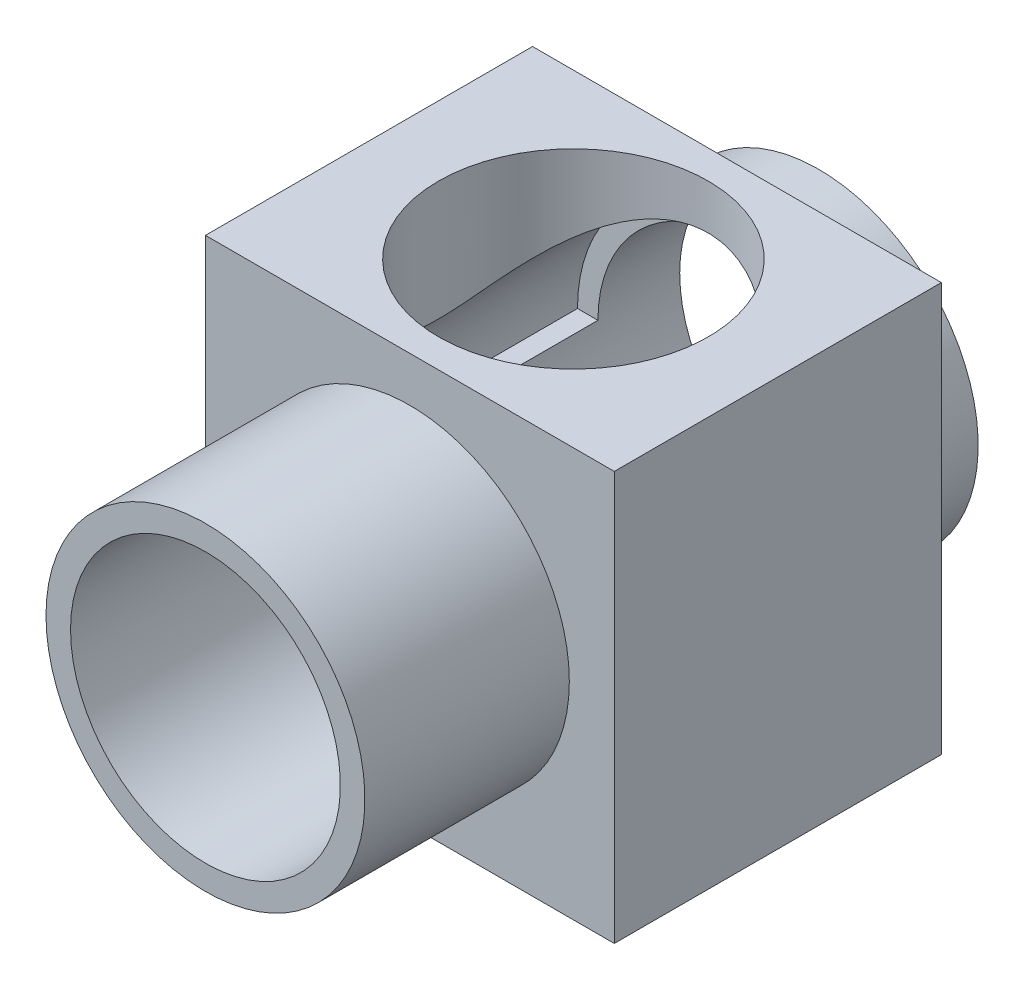
ISO-10303-21;
HEADER;
FILE_DESCRIPTION(('STEP AP214'),'2;1');
FILE_NAME('part.step','',(''),(''),'','','');
FILE_SCHEMA(('AUTOMOTIVE_DESIGN { 1 0 10303 214 1 1 1 1 }'));
ENDSEC;
DATA;
#1=APPLICATION_CONTEXT('core data for automotive mechanical design processes');
#2=APPLICATION_PROTOCOL_DEFINITION('international standard','automotive_design',2000,#1);
#3=PRODUCT_CONTEXT('',#1,'mechanical');
#4=PRODUCT('Part','Part','',(#3));
#5=PRODUCT_RELATED_PRODUCT_CATEGORY('part','',(#4));
#6=PRODUCT_DEFINITION_FORMATION('','',#4);
#7=PRODUCT_DEFINITION_CONTEXT('part definition',#1,'design');
#8=PRODUCT_DEFINITION('design','',#6,#7);
#9=PRODUCT_DEFINITION_SHAPE('','',#8);
#10=(LENGTH_UNIT() NAMED_UNIT(*) SI_UNIT(.MILLI.,.METRE.));
#11=(NAMED_UNIT(*) PLANE_ANGLE_UNIT() SI_UNIT($,.RADIAN.));
#12=(NAMED_UNIT(*) SI_UNIT($,.STERADIAN.) SOLID_ANGLE_UNIT());
#13=UNCERTAINTY_MEASURE_WITH_UNIT(LENGTH_MEASURE(1.E-05),#10,'distance_accuracy_value','');
#14=(GEOMETRIC_REPRESENTATION_CONTEXT(3) GLOBAL_UNCERTAINTY_ASSIGNED_CONTEXT((#13)) GLOBAL_UNIT_ASSIGNED_CONTEXT((#10,
#11,#12)) REPRESENTATION_CONTEXT('',''));
#15=CARTESIAN_POINT('',(0.,0.,0.));
#16=DIRECTION('',(0.,0.,1.));
#17=DIRECTION('',(1.,0.,0.));
#18=AXIS2_PLACEMENT_3D('',#15,#16,#17);
#19=CARTESIAN_POINT('',(0.,0.,0.));
#20=DIRECTION('',(0.,0.,1.));
#21=DIRECTION('',(1.,0.,0.));
#22=AXIS2_PLACEMENT_3D('',#19,#20,#21);
#23=PLANE('',#22);
#24=CARTESIAN_POINT('',(0.,0.,0.));
#25=DIRECTION('',(0.,0.,1.));
#26=DIRECTION('',(1.,0.,0.));
#27=AXIS2_PLACEMENT_3D('',#24,#25,#26);
#28=CIRCLE('',#27,3.4);
#29=CARTESIAN_POINT('',(-3.4,0.,0.));
#30=VERTEX_POINT('',#29);
#31=EDGE_CURVE('E28',#30,#30,#28,.T.);
#32=ORIENTED_EDGE('',*,*,#31,.T.);
#33=EDGE_LOOP('',(#32));
#34=FACE_BOUND('',#33,.T.);
#35=CARTESIAN_POINT('',(0.,0.,0.));
#36=DIRECTION('',(0.,0.,1.));
#37=DIRECTION('',(1.,0.,0.));
#38=AXIS2_PLACEMENT_3D('',#35,#36,#37);
#39=CIRCLE('',#38,3.9);
#40=CARTESIAN_POINT('',(-3.9,0.,0.));
#41=VERTEX_POINT('',#40);
#42=EDGE_CURVE('E274',#41,#41,#39,.T.);
#43=ORIENTED_EDGE('',*,*,#42,.F.);
#44=EDGE_LOOP('',(#43));
#45=FACE_BOUND('',#44,.T.);
#46=ADVANCED_FACE('F16',(#34,#45),#23,.F.);
#47=CARTESIAN_POINT('',(0.,0.,0.));
#48=DIRECTION('',(0.,0.,1.));
#49=DIRECTION('',(1.,0.,0.));
#50=AXIS2_PLACEMENT_3D('',#47,#48,#49);
#51=CYLINDRICAL_SURFACE('',#50,3.4);
#52=ORIENTED_EDGE('',*,*,#31,.F.);
#53=DIRECTION('',(0.,0.,1.));
#54=VECTOR('',#53,1.);
#55=CARTESIAN_POINT('',(-3.4,0.,0.));
#56=LINE('',#55,#54);
#57=CARTESIAN_POINT('',(-3.4,0.,2.));
#58=VERTEX_POINT('',#57);
#59=EDGE_CURVE('E10',#30,#58,#56,.T.);
#60=ORIENTED_EDGE('',*,*,#59,.T.);
#61=DIRECTION('',(0.,0.,1.));
#62=VECTOR('',#61,1.);
#63=CARTESIAN_POINT('',(-3.4,0.,2.));
#64=LINE('',#63,#62);
#65=CARTESIAN_POINT('',(-3.4,0.,10.));
#66=VERTEX_POINT('',#65);
#67=EDGE_CURVE('E157',#58,#66,#64,.T.);
#68=ORIENTED_EDGE('',*,*,#67,.T.);
#69=CARTESIAN_POINT('',(0.,0.,10.));
#70=DIRECTION('',(0.,0.,-1.));
#71=DIRECTION('',(-1.,0.,0.));
#72=AXIS2_PLACEMENT_3D('',#69,#70,#71);
#73=CIRCLE('',#72,3.4);
#74=CARTESIAN_POINT('',(3.4,0.,10.));
#75=VERTEX_POINT('',#74);
#76=EDGE_CURVE('E156',#75,#66,#73,.T.);
#77=ORIENTED_EDGE('',*,*,#76,.F.);
#78=DIRECTION('',(0.,0.,1.));
#79=VECTOR('',#78,1.);
#80=CARTESIAN_POINT('',(3.4,0.,2.));
#81=LINE('',#80,#79);
#82=CARTESIAN_POINT('',(3.4,0.,2.));
#83=VERTEX_POINT('',#82);
#84=EDGE_CURVE('E132',#83,#75,#81,.T.);
#85=ORIENTED_EDGE('',*,*,#84,.F.);
#86=CARTESIAN_POINT('',(0.,0.,2.));
#87=DIRECTION('',(0.,0.,-1.));
#88=DIRECTION('',(1.,0.,0.));
#89=AXIS2_PLACEMENT_3D('',#86,#87,#88);
#90=CIRCLE('',#89,3.4);
#91=EDGE_CURVE('E286',#58,#83,#90,.T.);
#92=ORIENTED_EDGE('',*,*,#91,.F.);
#93=ORIENTED_EDGE('',*,*,#59,.F.);
#94=EDGE_LOOP('',(#52,#60,#68,#77,#85,#92,#93));
#95=FACE_BOUND('',#94,.T.);
#96=ADVANCED_FACE('F160',(#95),#51,.F.);
#97=CARTESIAN_POINT('',(0.,0.,2.));
#98=DIRECTION('',(0.,0.,1.));
#99=DIRECTION('',(1.,0.,0.));
#100=AXIS2_PLACEMENT_3D('',#97,#98,#99);
#101=PLANE('',#100);
#102=DIRECTION('',(1.,0.,0.));
#103=VECTOR('',#102,1.);
#104=CARTESIAN_POINT('',(-1.7,0.,2.));
#105=LINE('',#104,#103);
#106=CARTESIAN_POINT('',(-3.9,0.,2.));
#107=VERTEX_POINT('',#106);
#108=EDGE_CURVE('E142',#107,#58,#105,.T.);
#109=ORIENTED_EDGE('',*,*,#108,.T.);
#110=ORIENTED_EDGE('',*,*,#91,.T.);
#111=DIRECTION('',(1.,0.,0.));
#112=VECTOR('',#111,1.);
#113=CARTESIAN_POINT('',(1.95,0.,2.));
#114=LINE('',#113,#112);
#115=CARTESIAN_POINT('',(3.9,0.,2.));
#116=VERTEX_POINT('',#115);
#117=EDGE_CURVE('E137',#83,#116,#114,.T.);
#118=ORIENTED_EDGE('',*,*,#117,.T.);
#119=CARTESIAN_POINT('',(0.,0.,2.));
#120=DIRECTION('',(0.,0.,1.));
#121=DIRECTION('',(1.,0.,0.));
#122=AXIS2_PLACEMENT_3D('',#119,#120,#121);
#123=CIRCLE('',#122,3.9);
#124=EDGE_CURVE('E279',#116,#107,#123,.T.);
#125=ORIENTED_EDGE('',*,*,#124,.T.);
#126=EDGE_LOOP('',(#109,#110,#118,#125));
#127=FACE_BOUND('',#126,.T.);
#128=ADVANCED_FACE('F315',(#127),#101,.T.);
#129=CARTESIAN_POINT('',(-3.4,0.,2.));
#130=DIRECTION('',(0.,1.,0.));
#131=DIRECTION('',(1.,0.,0.));
#132=AXIS2_PLACEMENT_3D('',#129,#130,#131);
#133=PLANE('',#132);
#134=ORIENTED_EDGE('',*,*,#108,.F.);
#135=DIRECTION('',(0.,0.,1.));
#136=VECTOR('',#135,1.);
#137=CARTESIAN_POINT('',(-3.9,0.,2.));
#138=LINE('',#137,#136);
#139=CARTESIAN_POINT('',(-3.9,0.,10.));
#140=VERTEX_POINT('',#139);
#141=EDGE_CURVE('E234',#107,#140,#138,.T.);
#142=ORIENTED_EDGE('',*,*,#141,.T.);
#143=DIRECTION('',(-1.,0.,0.));
#144=VECTOR('',#143,1.);
#145=CARTESIAN_POINT('',(-3.4,0.,10.));
#146=LINE('',#145,#144);
#147=EDGE_CURVE('E186',#66,#140,#146,.T.);
#148=ORIENTED_EDGE('',*,*,#147,.F.);
#149=ORIENTED_EDGE('',*,*,#67,.F.);
#150=EDGE_LOOP('',(#134,#142,#148,#149));
#151=FACE_BOUND('',#150,.T.);
#152=ADVANCED_FACE('F313',(#151),#133,.T.);
#153=CARTESIAN_POINT('',(3.9,0.,2.));
#154=DIRECTION('',(0.,1.,0.));
#155=DIRECTION('',(1.,0.,0.));
#156=AXIS2_PLACEMENT_3D('',#153,#154,#155);
#157=PLANE('',#156);
#158=ORIENTED_EDGE('',*,*,#117,.F.);
#159=ORIENTED_EDGE('',*,*,#84,.T.);
#160=DIRECTION('',(-1.,0.,0.));
#161=VECTOR('',#160,1.);
#162=CARTESIAN_POINT('',(3.4,0.,10.));
#163=LINE('',#162,#161);
#164=CARTESIAN_POINT('',(3.9,0.,10.));
#165=VERTEX_POINT('',#164);
#166=EDGE_CURVE('E140',#165,#75,#163,.T.);
#167=ORIENTED_EDGE('',*,*,#166,.F.);
#168=DIRECTION('',(0.,0.,1.));
#169=VECTOR('',#168,1.);
#170=CARTESIAN_POINT('',(3.9,0.,2.));
#171=LINE('',#170,#169);
#172=EDGE_CURVE('E235',#116,#165,#171,.T.);
#173=ORIENTED_EDGE('',*,*,#172,.F.);
#174=EDGE_LOOP('',(#158,#159,#167,#173));
#175=FACE_BOUND('',#174,.T.);
#176=ADVANCED_FACE('F134',(#175),#157,.T.);
#177=CARTESIAN_POINT('',(0.,0.,0.));
#178=DIRECTION('',(0.,0.,1.));
#179=DIRECTION('',(1.,0.,0.));
#180=AXIS2_PLACEMENT_3D('',#177,#178,#179);
#181=CYLINDRICAL_SURFACE('',#180,3.9);
#182=CARTESIAN_POINT('',(0.,0.,2.));
#183=DIRECTION('',(0.,0.,-1.));
#184=DIRECTION('',(1.,0.,0.));
#185=AXIS2_PLACEMENT_3D('',#182,#183,#184);
#186=CIRCLE('',#185,3.9);
#187=EDGE_CURVE('E270',#116,#107,#186,.T.);
#188=ORIENTED_EDGE('',*,*,#187,.T.);
#189=DIRECTION('',(0.,0.,-1.));
#190=VECTOR('',#189,1.);
#191=CARTESIAN_POINT('',(-3.9,0.,0.));
#192=LINE('',#191,#190);
#193=EDGE_CURVE('E271',#107,#41,#192,.T.);
#194=ORIENTED_EDGE('',*,*,#193,.T.);
#195=ORIENTED_EDGE('',*,*,#42,.T.);
#196=ORIENTED_EDGE('',*,*,#193,.F.);
#197=ORIENTED_EDGE('',*,*,#124,.F.);
#198=EDGE_LOOP('',(#188,#194,#195,#196,#197));
#199=FACE_BOUND('',#198,.T.);
#200=ADVANCED_FACE('F297',(#199),#181,.T.);
#201=CARTESIAN_POINT('',(0.,0.,2.));
#202=DIRECTION('',(0.,0.,1.));
#203=DIRECTION('',(1.,0.,0.));
#204=AXIS2_PLACEMENT_3D('',#201,#202,#203);
#205=PLANE('',#204);
#206=CARTESIAN_POINT('',(0.,0.,2.));
#207=DIRECTION('',(0.,0.,1.));
#208=DIRECTION('',(1.,0.,0.));
#209=AXIS2_PLACEMENT_3D('',#206,#207,#208);
#210=CIRCLE('',#209,3.9);
#211=EDGE_CURVE('E238',#116,#107,#210,.T.);
#212=ORIENTED_EDGE('',*,*,#211,.T.);
#213=ORIENTED_EDGE('',*,*,#187,.F.);
#214=EDGE_LOOP('',(#212,#213));
#215=FACE_BOUND('',#214,.T.);
#216=DIRECTION('',(0.,1.,0.));
#217=VECTOR('',#216,1.);
#218=CARTESIAN_POINT('',(5.00000007450581,-5.00000007450581,2.));
#219=LINE('',#218,#217);
#220=CARTESIAN_POINT('',(5.00000007450581,-5.00000007450581,2.));
#221=VERTEX_POINT('',#220);
#222=CARTESIAN_POINT('',(5.00000007450581,5.00000007450581,2.));
#223=VERTEX_POINT('',#222);
#224=EDGE_CURVE('E262',#221,#223,#219,.T.);
#225=ORIENTED_EDGE('',*,*,#224,.F.);
#226=DIRECTION('',(1.,0.,0.));
#227=VECTOR('',#226,1.);
#228=CARTESIAN_POINT('',(-5.00000007450581,-5.00000007450581,2.));
#229=LINE('',#228,#227);
#230=CARTESIAN_POINT('',(-5.00000007450581,-5.00000007450581,2.));
#231=VERTEX_POINT('',#230);
#232=EDGE_CURVE('E245',#231,#221,#229,.T.);
#233=ORIENTED_EDGE('',*,*,#232,.F.);
#234=DIRECTION('',(0.,-1.,0.));
#235=VECTOR('',#234,1.);
#236=CARTESIAN_POINT('',(-5.00000007450581,5.00000007450581,2.));
#237=LINE('',#236,#235);
#238=CARTESIAN_POINT('',(-5.00000007450581,5.00000007450581,2.));
#239=VERTEX_POINT('',#238);
#240=EDGE_CURVE('E252',#239,#231,#237,.T.);
#241=ORIENTED_EDGE('',*,*,#240,.F.);
#242=DIRECTION('',(-1.,0.,0.));
#243=VECTOR('',#242,1.);
#244=CARTESIAN_POINT('',(5.00000007450581,5.00000007450581,2.));
#245=LINE('',#244,#243);
#246=EDGE_CURVE('E256',#223,#239,#245,.T.);
#247=ORIENTED_EDGE('',*,*,#246,.F.);
#248=EDGE_LOOP('',(#225,#233,#241,#247));
#249=FACE_BOUND('',#248,.T.);
#250=ADVANCED_FACE('F302',(#215,#249),#205,.F.);
#251=CARTESIAN_POINT('',(5.00000007450581,-5.00000007450581,2.));
#252=DIRECTION('',(1.,0.,0.));
#253=DIRECTION('',(0.,1.,0.));
#254=AXIS2_PLACEMENT_3D('',#251,#252,#253);
#255=PLANE('',#254);
#256=ORIENTED_EDGE('',*,*,#224,.T.);
#257=DIRECTION('',(0.,0.,1.));
#258=VECTOR('',#257,1.);
#259=CARTESIAN_POINT('',(5.00000007450581,5.00000007450581,2.));
#260=LINE('',#259,#258);
#261=CARTESIAN_POINT('',(5.00000007450581,5.00000007450581,10.));
#262=VERTEX_POINT('',#261);
#263=EDGE_CURVE('E261',#223,#262,#260,.T.);
#264=ORIENTED_EDGE('',*,*,#263,.T.);
#265=DIRECTION('',(0.,1.,0.));
#266=VECTOR('',#265,1.);
#267=CARTESIAN_POINT('',(5.00000007450581,-5.00000007450581,10.));
#268=LINE('',#267,#266);
#269=CARTESIAN_POINT('',(5.00000007450581,-5.00000007450581,10.));
#270=VERTEX_POINT('',#269);
#271=EDGE_CURVE('E190',#270,#262,#268,.T.);
#272=ORIENTED_EDGE('',*,*,#271,.F.);
#273=DIRECTION('',(0.,0.,1.));
#274=VECTOR('',#273,1.);
#275=CARTESIAN_POINT('',(5.00000007450581,-5.00000007450581,2.));
#276=LINE('',#275,#274);
#277=EDGE_CURVE('E248',#221,#270,#276,.T.);
#278=ORIENTED_EDGE('',*,*,#277,.F.);
#279=EDGE_LOOP('',(#256,#264,#272,#278));
#280=FACE_BOUND('',#279,.T.);
#281=ADVANCED_FACE('F326',(#280),#255,.T.);
#282=CARTESIAN_POINT('',(5.00000007450581,5.00000007450581,2.));
#283=DIRECTION('',(0.,1.,0.));
#284=DIRECTION('',(1.,0.,0.));
#285=AXIS2_PLACEMENT_3D('',#282,#283,#284);
#286=PLANE('',#285);
#287=CARTESIAN_POINT('',(0.,5.00000007450581,6.));
#288=DIRECTION('',(0.,-1.,0.));
#289=DIRECTION('',(1.,0.,0.));
#290=AXIS2_PLACEMENT_3D('',#287,#288,#289);
#291=CIRCLE('',#290,3.3);
#292=CARTESIAN_POINT('',(-3.3,5.00000007450581,6.));
#293=VERTEX_POINT('',#292);
#294=EDGE_CURVE('E228',#293,#293,#291,.T.);
#295=ORIENTED_EDGE('',*,*,#294,.T.);
#296=EDGE_LOOP('',(#295));
#297=FACE_BOUND('',#296,.T.);
#298=ORIENTED_EDGE('',*,*,#246,.T.);
#299=DIRECTION('',(0.,0.,1.));
#300=VECTOR('',#299,1.);
#301=CARTESIAN_POINT('',(-5.00000007450581,5.00000007450581,2.));
#302=LINE('',#301,#300);
#303=CARTESIAN_POINT('',(-5.00000007450581,5.00000007450581,10.));
#304=VERTEX_POINT('',#303);
#305=EDGE_CURVE('E254',#239,#304,#302,.T.);
#306=ORIENTED_EDGE('',*,*,#305,.T.);
#307=DIRECTION('',(-1.,0.,0.));
#308=VECTOR('',#307,1.);
#309=CARTESIAN_POINT('',(5.00000007450581,5.00000007450581,10.));
#310=LINE('',#309,#308);
#311=EDGE_CURVE('E177',#262,#304,#310,.T.);
#312=ORIENTED_EDGE('',*,*,#311,.F.);
#313=ORIENTED_EDGE('',*,*,#263,.F.);
#314=EDGE_LOOP('',(#298,#306,#312,#313));
#315=FACE_BOUND('',#314,.T.);
#316=ADVANCED_FACE('F330',(#297,#315),#286,.T.);
#317=CARTESIAN_POINT('',(-5.00000007450581,5.00000007450581,2.));
#318=DIRECTION('',(-1.,0.,0.));
#319=DIRECTION('',(0.,0.,1.));
#320=AXIS2_PLACEMENT_3D('',#317,#318,#319);
#321=PLANE('',#320);
#322=ORIENTED_EDGE('',*,*,#240,.T.);
#323=DIRECTION('',(0.,0.,1.));
#324=VECTOR('',#323,1.);
#325=CARTESIAN_POINT('',(-5.00000007450581,-5.00000007450581,2.));
#326=LINE('',#325,#324);
#327=CARTESIAN_POINT('',(-5.00000007450581,-5.00000007450581,10.));
#328=VERTEX_POINT('',#327);
#329=EDGE_CURVE('E247',#231,#328,#326,.T.);
#330=ORIENTED_EDGE('',*,*,#329,.T.);
#331=DIRECTION('',(0.,-1.,0.));
#332=VECTOR('',#331,1.);
#333=CARTESIAN_POINT('',(-5.00000007450581,5.00000007450581,10.));
#334=LINE('',#333,#332);
#335=EDGE_CURVE('E175',#304,#328,#334,.T.);
#336=ORIENTED_EDGE('',*,*,#335,.F.);
#337=ORIENTED_EDGE('',*,*,#305,.F.);
#338=EDGE_LOOP('',(#322,#330,#336,#337));
#339=FACE_BOUND('',#338,.T.);
#340=ADVANCED_FACE('F328',(#339),#321,.T.);
#341=CARTESIAN_POINT('',(-5.00000007450581,-5.00000007450581,2.));
#342=DIRECTION('',(0.,-1.,0.));
#343=DIRECTION('',(0.,0.,-1.));
#344=AXIS2_PLACEMENT_3D('',#341,#342,#343);
#345=PLANE('',#344);
#346=ORIENTED_EDGE('',*,*,#232,.T.);
#347=ORIENTED_EDGE('',*,*,#277,.T.);
#348=DIRECTION('',(1.,0.,0.));
#349=VECTOR('',#348,1.);
#350=CARTESIAN_POINT('',(-5.00000007450581,-5.00000007450581,10.));
#351=LINE('',#350,#349);
#352=EDGE_CURVE('E178',#328,#270,#351,.T.);
#353=ORIENTED_EDGE('',*,*,#352,.F.);
#354=ORIENTED_EDGE('',*,*,#329,.F.);
#355=EDGE_LOOP('',(#346,#347,#353,#354));
#356=FACE_BOUND('',#355,.T.);
#357=ADVANCED_FACE('F335',(#356),#345,.T.);
#358=CARTESIAN_POINT('',(0.,0.,2.));
#359=DIRECTION('',(0.,0.,1.));
#360=DIRECTION('',(1.,0.,0.));
#361=AXIS2_PLACEMENT_3D('',#358,#359,#360);
#362=CYLINDRICAL_SURFACE('',#361,3.9);
#363=CARTESIAN_POINT('',(3.3,2.07846096908265,6.));
#364=CARTESIAN_POINT('',(3.29998949526367,2.07848967748187,5.88643573354796));
#365=CARTESIAN_POINT('',(3.29406597516664,2.0879730738853,5.77275929706719));
#366=CARTESIAN_POINT('',(3.27100915019799,2.12388973017323,5.54916306858329));
#367=CARTESIAN_POINT('',(3.25383842334817,2.15037956843142,5.43925711105789));
#368=CARTESIAN_POINT('',(3.20073569381922,2.22896908055555,5.18217819806354));
#369=CARTESIAN_POINT('',(3.16002509562758,2.28709291888373,5.03790445062325));
#370=CARTESIAN_POINT('',(3.06221261837043,2.41649697894376,4.76124150705334));
#371=CARTESIAN_POINT('',(3.00505836564402,2.48781897413208,4.62889208765124));
#372=CARTESIAN_POINT('',(2.89247997701878,2.61704679983131,4.40793146543472));
#373=CARTESIAN_POINT('',(2.8403973966159,2.67368040638614,4.31683095354394));
#374=CARTESIAN_POINT('',(2.72817313021274,2.7880979029279,4.14042684538399));
#375=CARTESIAN_POINT('',(2.66802774677677,2.84588231023531,4.05512593590349));
#376=CARTESIAN_POINT('',(2.53982215504612,2.96086371481513,3.89045679043932));
#377=CARTESIAN_POINT('',(2.47177081627084,3.01806129348453,3.81108206718098));
#378=CARTESIAN_POINT('',(2.32768826923873,3.13053143088203,3.65844417304491));
#379=CARTESIAN_POINT('',(2.25165624338548,3.18580379160353,3.58518162972352));
#380=CARTESIAN_POINT('',(2.04645696847235,3.32335550040197,3.40584551711612));
#381=CARTESIAN_POINT('',(1.91146848775494,3.40332655432936,3.30451227397209));
#382=CARTESIAN_POINT('',(1.62255262441044,3.55013984824459,3.12137837288261));
#383=CARTESIAN_POINT('',(1.46865751667387,3.61700396968695,3.03954511044761));
#384=CARTESIAN_POINT('',(1.17279202738793,3.72218366617774,2.91200652174038));
#385=CARTESIAN_POINT('',(1.0335410311634,3.76345853972171,2.86246884892982));
#386=CARTESIAN_POINT('',(0.746203511334892,3.83078331970602,2.78202098925685));
#387=CARTESIAN_POINT('',(0.598122150008771,3.85684202726982,2.75110003404864));
#388=CARTESIAN_POINT('',(0.296385680314963,3.8916969341441,2.70979788281975));
#389=CARTESIAN_POINT('',(0.142708646143264,3.90041557302585,2.69950897022043));
#390=CARTESIAN_POINT('',(-0.164520637101701,3.89955392936846,2.70052707243962));
#391=CARTESIAN_POINT('',(-0.318072893997962,3.88997489961316,2.71183260875412));
#392=CARTESIAN_POINT('',(-0.609043777245994,3.85473744892898,2.7536000178335));
#393=CARTESIAN_POINT('',(-0.746825694301629,3.830293100679,2.78261605166605));
#394=CARTESIAN_POINT('',(-1.01477472788352,3.76817805860573,2.85682076899917));
#395=CARTESIAN_POINT('',(-1.14494066837862,3.73050532835951,2.90201194257747));
#396=CARTESIAN_POINT('',(-1.40564892807815,3.64069590798959,3.01073789624869));
#397=CARTESIAN_POINT('',(-1.53537291982206,3.58763691474864,3.07545923191233));
#398=CARTESIAN_POINT('',(-1.78204863693718,3.47173375882872,3.21886690125446));
#399=CARTESIAN_POINT('',(-1.89898989798792,3.40888167981843,3.29756454006569));
#400=CARTESIAN_POINT('',(-2.17386986791074,3.24361805103567,3.50854402109477));
#401=CARTESIAN_POINT('',(-2.32371150978478,3.13694560303466,3.64815212150378));
#402=CARTESIAN_POINT('',(-2.52607809563117,2.97263324871895,3.87416016805317));
#403=CARTESIAN_POINT('',(-2.58988122037565,2.91705699115583,3.95239441093367));
#404=CARTESIAN_POINT('',(-2.71002580586362,2.80579068458622,4.11428822046833));
#405=CARTESIAN_POINT('',(-2.76636973248677,2.75010067939578,4.19794598051052));
#406=CARTESIAN_POINT('',(-2.89903419371393,2.61130914940025,4.41590212891783));
#407=CARTESIAN_POINT('',(-2.9704404677041,2.52906492932369,4.55384969481582));
#408=CARTESIAN_POINT('',(-3.0635504917927,2.41394341541776,4.77084950447894));
#409=CARTESIAN_POINT('',(-3.09223436218014,2.37697334235492,4.84479132465909));
#410=CARTESIAN_POINT('',(-3.14466809321152,2.30715387390112,4.99626269220132));
#411=CARTESIAN_POINT('',(-3.16842074493528,2.27430215170975,5.07379017951472));
#412=CARTESIAN_POINT('',(-3.21629449898004,2.20626819653551,5.25411413931871));
#413=CARTESIAN_POINT('',(-3.23876614912291,2.1728731025174,5.35805826186497));
#414=CARTESIAN_POINT('',(-3.27375114337476,2.11980885363205,5.57090543626522));
#415=CARTESIAN_POINT('',(-3.28628935977042,2.10010543155672,5.6797953760426));
#416=CARTESIAN_POINT('',(-3.30039233441102,2.07788748657917,5.90112885084742));
#417=CARTESIAN_POINT('',(-3.30185867590508,2.07552712934574,6.01359535299859));
#418=CARTESIAN_POINT('',(-3.29338063194083,2.08894383644617,6.23704095246085));
#419=CARTESIAN_POINT('',(-3.28342316727648,2.10474169029837,6.34801819741216));
#420=CARTESIAN_POINT('',(-3.24985663150636,2.15627650142047,6.58836760247432));
#421=CARTESIAN_POINT('',(-3.22378299443765,2.19555573328204,6.71659664271412));
#422=CARTESIAN_POINT('',(-3.15855804721134,2.28838479083599,6.96439220601591));
#423=CARTESIAN_POINT('',(-3.11936171372637,2.34198361667571,7.08392715744132));
#424=CARTESIAN_POINT('',(-3.03783943159364,2.44644484239031,7.29292188381232));
#425=CARTESIAN_POINT('',(-2.99744950726212,2.49596397189117,7.38384193224764));
#426=CARTESIAN_POINT('',(-2.90944614910156,2.59801126637827,7.56040393367774));
#427=CARTESIAN_POINT('',(-2.86182851117975,2.65054117148037,7.6460427737523));
#428=CARTESIAN_POINT('',(-2.75953170494697,2.75688976606534,7.81232524150063));
#429=CARTESIAN_POINT('',(-2.70484352288939,2.81071002794115,7.89296229515713));
#430=CARTESIAN_POINT('',(-2.58852599065279,2.9181850831505,8.04914871222287));
#431=CARTESIAN_POINT('',(-2.52689811538327,2.9718399091634,8.12469915126872));
#432=CARTESIAN_POINT('',(-2.39421249633357,3.07982767194658,8.27333267348684));
#433=CARTESIAN_POINT('',(-2.32288598291635,3.13410930959397,8.3462138936957));
#434=CARTESIAN_POINT('',(-2.17269897297619,3.24003501780153,8.4859404813635));
#435=CARTESIAN_POINT('',(-2.09383704676851,3.29167858498011,8.55278469873094));
#436=CARTESIAN_POINT('',(-1.92883863127193,3.39099157771499,8.67962206162885));
#437=CARTESIAN_POINT('',(-1.84272200873281,3.43867118908246,8.7396329229383));
#438=CARTESIAN_POINT('',(-1.66329210719978,3.52895860970197,8.85213468809039));
#439=CARTESIAN_POINT('',(-1.56998278639985,3.57156917611049,8.90462968315705));
#440=CARTESIAN_POINT('',(-1.34175523178891,3.66467045253401,9.01848323913877));
#441=CARTESIAN_POINT('',(-1.20391133862818,3.71251085299463,9.07627396504213));
#442=CARTESIAN_POINT('',(-0.917782718232842,3.79338112416786,9.17339917641798));
#443=CARTESIAN_POINT('',(-0.769505998312784,3.82642221309615,9.21274764259752));
#444=CARTESIAN_POINT('',(-0.46517385140355,3.87523774257902,9.27073646063397));
#445=CARTESIAN_POINT('',(-0.309077983868334,3.8909100147143,9.28925429011024));
#446=CARTESIAN_POINT('',(0.00489895571466315,3.90315664738978,9.30373252406225));
#447=CARTESIAN_POINT('',(0.162779521789281,3.89973629169259,9.29969916943343));
#448=CARTESIAN_POINT('',(0.46064409653,3.87532212965721,9.27080576331135));
#449=CARTESIAN_POINT('',(0.600956793179934,3.85594309375273,9.24785924845565));
#450=CARTESIAN_POINT('',(0.874942039966707,3.80315101992588,9.18500346118597));
#451=CARTESIAN_POINT('',(1.00861301098805,3.76973466222065,9.14509017615704));
#452=CARTESIAN_POINT('',(1.27339584897954,3.68898404168579,9.04784830515367));
#453=CARTESIAN_POINT('',(1.40402153900861,3.64102172880425,8.98972880996739));
#454=CARTESIAN_POINT('',(1.65336788389829,3.53479668705488,8.85940530856275));
#455=CARTESIAN_POINT('',(1.7720859495514,3.47653172554416,8.78719824913738));
#456=CARTESIAN_POINT('',(2.05123080645843,3.32244077692174,8.59300780936106));
#457=CARTESIAN_POINT('',(2.20418845563023,3.22204459947465,8.46380541052984));
#458=CARTESIAN_POINT('',(2.41264420676206,3.06542018554753,8.25365522559148));
#459=CARTESIAN_POINT('',(2.47878223763958,3.01205508525392,8.18066188592594));
#460=CARTESIAN_POINT('',(2.60401597152645,2.90446098301844,8.0294642848833));
#461=CARTESIAN_POINT('',(2.66311462264569,2.85023235358886,7.95126222647775));
#462=CARTESIAN_POINT('',(2.77532578366805,2.74113315961265,7.78817219715366));
#463=CARTESIAN_POINT('',(2.82830007660243,2.6862705233819,7.7031840207407));
#464=CARTESIAN_POINT('',(2.92682547523,2.57856849544143,7.52768736237806));
#465=CARTESIAN_POINT('',(2.9723723012605,2.52573028351222,7.43717573883302));
#466=CARTESIAN_POINT('',(3.0554846109715,2.42451629243727,7.25074935998165));
#467=CARTESIAN_POINT('',(3.09308619057109,2.37612092254315,7.15486165948467));
#468=CARTESIAN_POINT('',(3.15988039822698,2.28654021307567,6.95710633341893));
#469=CARTESIAN_POINT('',(3.18908519905485,2.24534447058398,6.85524762472302));
#470=CARTESIAN_POINT('',(3.24139422067097,2.1692877243403,6.63106424170148));
#471=CARTESIAN_POINT('',(3.26314933792635,2.1360243004081,6.50782967041273));
#472=CARTESIAN_POINT('',(3.28513562262099,2.10191843847519,6.31919935401463));
#473=CARTESIAN_POINT('',(3.2906895095423,2.09318295504499,6.25580871647051));
#474=CARTESIAN_POINT('',(3.29812432474344,2.08144664278727,6.12829056216407));
#475=CARTESIAN_POINT('',(3.30000593511812,2.07844474899536,6.06416318447136));
#476=CARTESIAN_POINT('',(3.3,2.07846096908265,6.));
#477=B_SPLINE_CURVE_WITH_KNOTS('',3,(#363,#364,#365,#366,#367,#368,#369,#370,#371,#372,#373,
#374,#375,#376,#377,#378,#379,#380,#381,#382,#383,#384,#385,#386,#387,#388,#389,#390,#391,#392,
#393,#394,#395,#396,#397,#398,#399,#400,#401,#402,#403,#404,#405,#406,#407,#408,#409,#410,#411,
#412,#413,#414,#415,#416,#417,#418,#419,#420,#421,#422,#423,#424,#425,#426,#427,#428,#429,#430,
#431,#432,#433,#434,#435,#436,#437,#438,#439,#440,#441,#442,#443,#444,#445,#446,#447,#448,#449,
#450,#451,#452,#453,#454,#455,#456,#457,#458,#459,#460,#461,#462,#463,#464,#465,#466,#467,#468,
#469,#470,#471,#472,#473,#474,#475,#476),.UNSPECIFIED.,.T.,.F.,(4,2,2,2,2,2,2,2,2,2,2,2,2,2,2,2,
2,2,2,2,2,2,2,2,2,2,2,2,2,2,2,2,2,2,2,2,2,2,2,2,2,2,2,2,2,2,2,2,2,2,2,2,2,2,2,2,4),(0.,
0.340408651046128,0.681955710802877,1.16159814549823,1.64278549988686,2.0001126877187,
2.35760430260442,2.71469865945609,3.07182963527912,3.62996048550598,4.18715147297107,
4.64560605955361,5.10379520985511,5.56402922710186,6.02423173470207,6.45112312201648,
6.87808025530108,7.33951345101858,7.80132160442365,8.49009315977828,8.83553579911903,
9.18086395451149,9.70635764099351,9.96863197449021,10.2307574530099,10.5640212288168,
10.8964478859177,11.23182600922,11.5675884931045,11.9751731934382,12.3841708774899,
12.7171439736828,13.050311495469,13.3839080165286,13.7174337708681,14.0635931803197,
14.4098183970797,14.7551245260702,15.1002419688746,15.5690678041683,16.0375376548458,
16.5087487912926,16.9798295295378,17.4083717301379,17.8370153367422,18.2877302623733,
18.738542980477,19.4065959259392,19.7424363792416,20.0781356834685,20.4203412060728,
20.7627432140645,21.1035545244763,21.4438692419427,21.8299624667456,22.0223272114846,
22.21465622267),.UNSPECIFIED.);
#478=CARTESIAN_POINT('',(-3.3,2.07846096908265,6.));
#479=VERTEX_POINT('',#478);
#480=EDGE_CURVE('E19',#479,#479,#477,.T.);
#481=ORIENTED_EDGE('',*,*,#480,.T.);
#482=EDGE_LOOP('',(#481));
#483=FACE_BOUND('',#482,.T.);
#484=ORIENTED_EDGE('',*,*,#172,.T.);
#485=CARTESIAN_POINT('',(0.,0.,10.));
#486=DIRECTION('',(0.,0.,-1.));
#487=DIRECTION('',(1.,0.,0.));
#488=AXIS2_PLACEMENT_3D('',#485,#486,#487);
#489=CIRCLE('',#488,3.9);
#490=EDGE_CURVE('E217',#140,#165,#489,.T.);
#491=ORIENTED_EDGE('',*,*,#490,.F.);
#492=ORIENTED_EDGE('',*,*,#141,.F.);
#493=ORIENTED_EDGE('',*,*,#211,.F.);
#494=EDGE_LOOP('',(#484,#491,#492,#493));
#495=FACE_BOUND('',#494,.T.);
#496=ADVANCED_FACE('F306',(#483,#495),#362,.F.);
#497=CARTESIAN_POINT('',(0.,0.,6.));
#498=DIRECTION('',(0.,1.,0.));
#499=DIRECTION('',(1.,0.,0.));
#500=AXIS2_PLACEMENT_3D('',#497,#498,#499);
#501=CYLINDRICAL_SURFACE('',#500,3.3);
#502=ORIENTED_EDGE('',*,*,#480,.F.);
#503=DIRECTION('',(0.,1.,0.));
#504=VECTOR('',#503,1.);
#505=CARTESIAN_POINT('',(-3.3,0.,6.));
#506=LINE('',#505,#504);
#507=EDGE_CURVE('E223',#479,#293,#506,.T.);
#508=ORIENTED_EDGE('',*,*,#507,.T.);
#509=ORIENTED_EDGE('',*,*,#294,.F.);
#510=ORIENTED_EDGE('',*,*,#507,.F.);
#511=EDGE_LOOP('',(#502,#508,#509,#510));
#512=FACE_BOUND('',#511,.T.);
#513=ADVANCED_FACE('F339',(#512),#501,.F.);
#514=CARTESIAN_POINT('',(0.,-1.95,10.));
#515=DIRECTION('',(0.,0.,1.));
#516=DIRECTION('',(1.,0.,0.));
#517=AXIS2_PLACEMENT_3D('',#514,#515,#516);
#518=PLANE('',#517);
#519=CARTESIAN_POINT('',(0.,0.,10.));
#520=DIRECTION('',(0.,0.,-1.));
#521=DIRECTION('',(1.,0.,0.));
#522=AXIS2_PLACEMENT_3D('',#519,#520,#521);
#523=CIRCLE('',#522,3.9);
#524=EDGE_CURVE('E193',#165,#140,#523,.T.);
#525=ORIENTED_EDGE('',*,*,#524,.T.);
#526=ORIENTED_EDGE('',*,*,#490,.T.);
#527=EDGE_LOOP('',(#525,#526));
#528=FACE_BOUND('',#527,.T.);
#529=ORIENTED_EDGE('',*,*,#271,.T.);
#530=ORIENTED_EDGE('',*,*,#311,.T.);
#531=ORIENTED_EDGE('',*,*,#335,.T.);
#532=ORIENTED_EDGE('',*,*,#352,.T.);
#533=EDGE_LOOP('',(#529,#530,#531,#532));
#534=FACE_BOUND('',#533,.T.);
#535=ADVANCED_FACE('F345',(#528,#534),#518,.T.);
#536=CARTESIAN_POINT('',(0.,0.,15.));
#537=DIRECTION('',(0.,0.,1.));
#538=DIRECTION('',(1.,0.,0.));
#539=AXIS2_PLACEMENT_3D('',#536,#537,#538);
#540=PLANE('',#539);
#541=CARTESIAN_POINT('',(0.,0.,15.));
#542=DIRECTION('',(0.,0.,-1.));
#543=DIRECTION('',(1.,0.,0.));
#544=AXIS2_PLACEMENT_3D('',#541,#542,#543);
#545=CIRCLE('',#544,3.3);
#546=CARTESIAN_POINT('',(-3.3,0.,15.));
#547=VERTEX_POINT('',#546);
#548=EDGE_CURVE('E153',#547,#547,#545,.T.);
#549=ORIENTED_EDGE('',*,*,#548,.T.);
#550=EDGE_LOOP('',(#549));
#551=FACE_BOUND('',#550,.T.);
#552=CARTESIAN_POINT('',(0.,0.,15.));
#553=DIRECTION('',(0.,0.,1.));
#554=DIRECTION('',(1.,0.,0.));
#555=AXIS2_PLACEMENT_3D('',#552,#553,#554);
#556=CIRCLE('',#555,3.9);
#557=CARTESIAN_POINT('',(-3.9,0.,15.));
#558=VERTEX_POINT('',#557);
#559=EDGE_CURVE('E197',#558,#558,#556,.T.);
#560=ORIENTED_EDGE('',*,*,#559,.T.);
#561=EDGE_LOOP('',(#560));
#562=FACE_BOUND('',#561,.T.);
#563=ADVANCED_FACE('F342',(#551,#562),#540,.T.);
#564=CARTESIAN_POINT('',(0.,0.,15.));
#565=DIRECTION('',(0.,0.,-1.));
#566=DIRECTION('',(1.,0.,0.));
#567=AXIS2_PLACEMENT_3D('',#564,#565,#566);
#568=CYLINDRICAL_SURFACE('',#567,3.9);
#569=CARTESIAN_POINT('',(0.,0.,10.));
#570=DIRECTION('',(0.,0.,-1.));
#571=DIRECTION('',(1.,0.,0.));
#572=AXIS2_PLACEMENT_3D('',#569,#570,#571);
#573=CIRCLE('',#572,3.9);
#574=EDGE_CURVE('E151',#140,#165,#573,.T.);
#575=ORIENTED_EDGE('',*,*,#574,.F.);
#576=DIRECTION('',(0.,0.,1.));
#577=VECTOR('',#576,1.);
#578=CARTESIAN_POINT('',(-3.9,0.,15.));
#579=LINE('',#578,#577);
#580=EDGE_CURVE('E201',#140,#558,#579,.T.);
#581=ORIENTED_EDGE('',*,*,#580,.T.);
#582=ORIENTED_EDGE('',*,*,#559,.F.);
#583=ORIENTED_EDGE('',*,*,#580,.F.);
#584=ORIENTED_EDGE('',*,*,#524,.F.);
#585=EDGE_LOOP('',(#575,#581,#582,#583,#584));
#586=FACE_BOUND('',#585,.T.);
#587=ADVANCED_FACE('F350',(#586),#568,.T.);
#588=CARTESIAN_POINT('',(0.,0.,15.));
#589=DIRECTION('',(0.,0.,-1.));
#590=DIRECTION('',(1.,0.,0.));
#591=AXIS2_PLACEMENT_3D('',#588,#589,#590);
#592=CYLINDRICAL_SURFACE('',#591,3.3);
#593=ORIENTED_EDGE('',*,*,#548,.F.);
#594=DIRECTION('',(0.,0.,-1.));
#595=VECTOR('',#594,1.);
#596=CARTESIAN_POINT('',(-3.3,0.,15.));
#597=LINE('',#596,#595);
#598=CARTESIAN_POINT('',(-3.3,0.,10.1));
#599=VERTEX_POINT('',#598);
#600=EDGE_CURVE('E199',#547,#599,#597,.T.);
#601=ORIENTED_EDGE('',*,*,#600,.T.);
#602=CARTESIAN_POINT('',(0.,0.,10.1));
#603=DIRECTION('',(0.,0.,1.));
#604=DIRECTION('',(1.,0.,0.));
#605=AXIS2_PLACEMENT_3D('',#602,#603,#604);
#606=CIRCLE('',#605,3.3);
#607=EDGE_CURVE('E183',#599,#599,#606,.T.);
#608=ORIENTED_EDGE('',*,*,#607,.F.);
#609=ORIENTED_EDGE('',*,*,#600,.F.);
#610=EDGE_LOOP('',(#593,#601,#608,#609));
#611=FACE_BOUND('',#610,.T.);
#612=ADVANCED_FACE('F353',(#611),#592,.F.);
#613=CARTESIAN_POINT('',(0.,0.,10.));
#614=DIRECTION('',(0.,0.,1.));
#615=DIRECTION('',(1.,0.,0.));
#616=AXIS2_PLACEMENT_3D('',#613,#614,#615);
#617=PLANE('',#616);
#618=CARTESIAN_POINT('',(0.,0.,10.));
#619=DIRECTION('',(0.,0.,-1.));
#620=DIRECTION('',(1.,0.,0.));
#621=AXIS2_PLACEMENT_3D('',#618,#619,#620);
#622=CIRCLE('',#621,3.4);
#623=EDGE_CURVE('E149',#66,#75,#622,.T.);
#624=ORIENTED_EDGE('',*,*,#623,.F.);
#625=ORIENTED_EDGE('',*,*,#147,.T.);
#626=ORIENTED_EDGE('',*,*,#574,.T.);
#627=ORIENTED_EDGE('',*,*,#166,.T.);
#628=EDGE_LOOP('',(#624,#625,#626,#627));
#629=FACE_BOUND('',#628,.T.);
#630=ADVANCED_FACE('F148',(#629),#617,.F.);
#631=CARTESIAN_POINT('',(0.,0.,10.1));
#632=DIRECTION('',(0.,0.,1.));
#633=DIRECTION('',(1.,0.,0.));
#634=AXIS2_PLACEMENT_3D('',#631,#632,#633);
#635=TOROIDAL_SURFACE('',#634,3.4,0.1);
#636=ORIENTED_EDGE('',*,*,#623,.T.);
#637=ORIENTED_EDGE('',*,*,#76,.T.);
#638=CARTESIAN_POINT('',(-3.4,0.,10.1));
#639=DIRECTION('',(0.,-1.,0.));
#640=DIRECTION('',(-1.,0.,0.));
#641=AXIS2_PLACEMENT_3D('',#638,#639,#640);
#642=CIRCLE('',#641,0.1);
#643=EDGE_CURVE('E163',#66,#599,#642,.T.);
#644=ORIENTED_EDGE('',*,*,#643,.T.);
#645=ORIENTED_EDGE('',*,*,#607,.T.);
#646=ORIENTED_EDGE('',*,*,#643,.F.);
#647=EDGE_LOOP('',(#636,#637,#644,#645,#646));
#648=FACE_BOUND('',#647,.T.);
#649=ADVANCED_FACE('F170',(#648),#635,.T.);
#650=CLOSED_SHELL('',(#46,#96,#128,#152,#176,#200,#250,#281,#316,#340,#357,#496,#513,#535,#563,
#587,#612,#630,#649));
#651=MANIFOLD_SOLID_BREP('B1',#650);
#652=ADVANCED_BREP_SHAPE_REPRESENTATION('',(#18,#651),#14);
#653=SHAPE_DEFINITION_REPRESENTATION(#9,#652);
ENDSEC;
END-ISO-10303-21;
